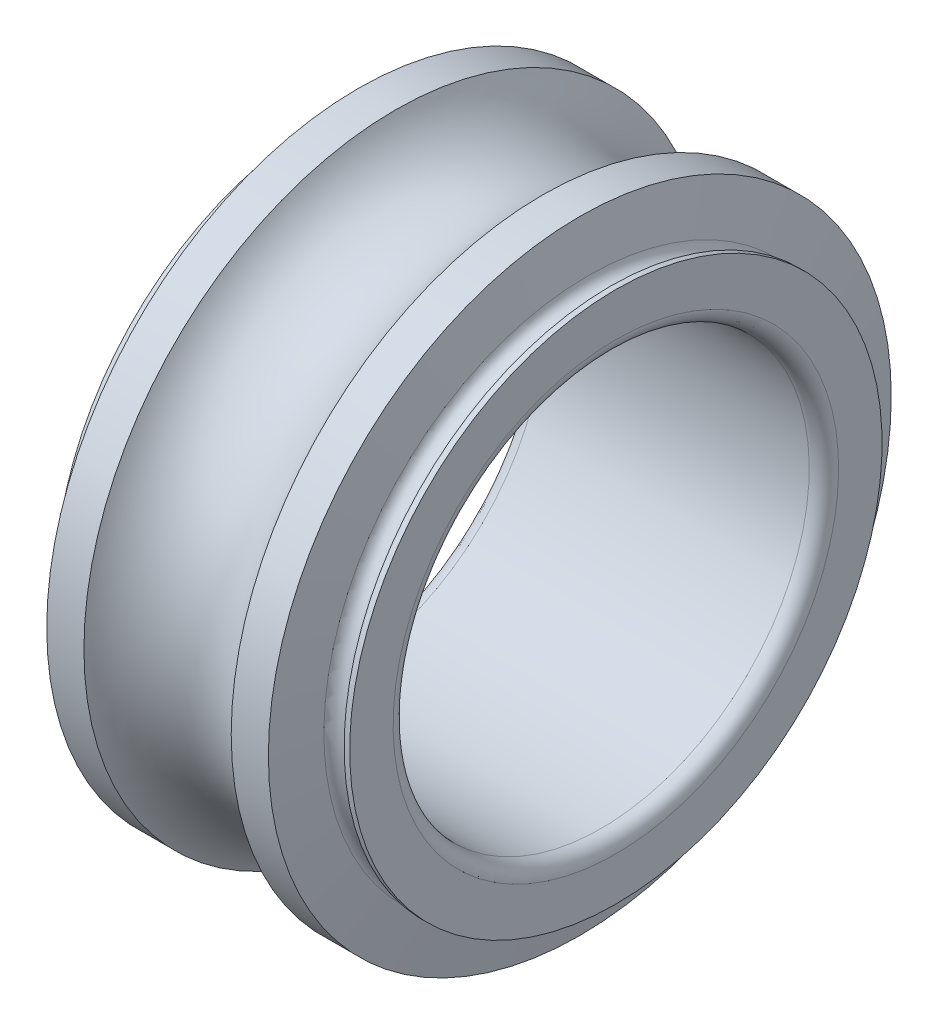
ISO-10303-21;
HEADER;
FILE_DESCRIPTION(('STEP AP214'),'2;1');
FILE_NAME('part.step','',(''),(''),'','','');
FILE_SCHEMA(('AUTOMOTIVE_DESIGN { 1 0 10303 214 1 1 1 1 }'));
ENDSEC;
DATA;
#1=APPLICATION_CONTEXT('core data for automotive mechanical design processes');
#2=APPLICATION_PROTOCOL_DEFINITION('international standard','automotive_design',2000,#1);
#3=PRODUCT_CONTEXT('',#1,'mechanical');
#4=PRODUCT('Part','Part','',(#3));
#5=PRODUCT_RELATED_PRODUCT_CATEGORY('part','',(#4));
#6=PRODUCT_DEFINITION_FORMATION('','',#4);
#7=PRODUCT_DEFINITION_CONTEXT('part definition',#1,'design');
#8=PRODUCT_DEFINITION('design','',#6,#7);
#9=PRODUCT_DEFINITION_SHAPE('','',#8);
#10=(LENGTH_UNIT() NAMED_UNIT(*) SI_UNIT(.MILLI.,.METRE.));
#11=(NAMED_UNIT(*) PLANE_ANGLE_UNIT() SI_UNIT($,.RADIAN.));
#12=(NAMED_UNIT(*) SI_UNIT($,.STERADIAN.) SOLID_ANGLE_UNIT());
#13=UNCERTAINTY_MEASURE_WITH_UNIT(LENGTH_MEASURE(1.E-05),#10,'distance_accuracy_value','');
#14=(GEOMETRIC_REPRESENTATION_CONTEXT(3) GLOBAL_UNCERTAINTY_ASSIGNED_CONTEXT((#13)) GLOBAL_UNIT_ASSIGNED_CONTEXT((#10,
#11,#12)) REPRESENTATION_CONTEXT('',''));
#15=CARTESIAN_POINT('',(0.,0.,0.));
#16=DIRECTION('',(0.,0.,1.));
#17=DIRECTION('',(1.,0.,0.));
#18=AXIS2_PLACEMENT_3D('',#15,#16,#17);
#19=CARTESIAN_POINT('',(9.76773972662286,0.,0.));
#20=DIRECTION('',(-1.,0.,0.));
#21=DIRECTION('',(0.,1.,0.));
#22=AXIS2_PLACEMENT_3D('',#19,#20,#21);
#23=CYLINDRICAL_SURFACE('',#22,12.72375);
#24=CARTESIAN_POINT('',(9.00849849385038,0.,0.));
#25=DIRECTION('',(1.,0.,0.));
#26=DIRECTION('',(0.,1.,0.));
#27=AXIS2_PLACEMENT_3D('',#24,#25,#26);
#28=CIRCLE('',#27,12.72375);
#29=CARTESIAN_POINT('',(9.00849849385038,12.72375,0.));
#30=VERTEX_POINT('',#29);
#31=EDGE_CURVE('E11',#30,#30,#28,.T.);
#32=ORIENTED_EDGE('',*,*,#31,.T.);
#33=EDGE_LOOP('',(#32));
#34=FACE_BOUND('',#33,.T.);
#35=CARTESIAN_POINT('',(10.5269809593953,0.,0.));
#36=DIRECTION('',(1.,0.,0.));
#37=DIRECTION('',(0.,1.,0.));
#38=AXIS2_PLACEMENT_3D('',#35,#36,#37);
#39=CIRCLE('',#38,12.72375);
#40=CARTESIAN_POINT('',(10.5269809593953,12.72375,0.));
#41=VERTEX_POINT('',#40);
#42=EDGE_CURVE('E103',#41,#41,#39,.T.);
#43=ORIENTED_EDGE('',*,*,#42,.F.);
#44=EDGE_LOOP('',(#43));
#45=FACE_BOUND('',#44,.T.);
#46=ADVANCED_FACE('F17',(#34,#45),#23,.T.);
#47=CARTESIAN_POINT('',(6.,0.,0.));
#48=DIRECTION('',(1.,0.,0.));
#49=DIRECTION('',(0.,0.,-1.));
#50=AXIS2_PLACEMENT_3D('',#47,#48,#49);
#51=TOROIDAL_SURFACE('',#50,14.25,3.3735);
#52=CARTESIAN_POINT('',(2.99150150614962,0.,0.));
#53=DIRECTION('',(1.,0.,0.));
#54=DIRECTION('',(0.,1.,0.));
#55=AXIS2_PLACEMENT_3D('',#52,#53,#54);
#56=CIRCLE('',#55,12.72375);
#57=CARTESIAN_POINT('',(2.99150150614962,12.72375,0.));
#58=VERTEX_POINT('',#57);
#59=EDGE_CURVE('E28',#58,#58,#56,.T.);
#60=ORIENTED_EDGE('',*,*,#59,.T.);
#61=EDGE_LOOP('',(#60));
#62=FACE_BOUND('',#61,.T.);
#63=ORIENTED_EDGE('',*,*,#31,.F.);
#64=EDGE_LOOP('',(#63));
#65=FACE_BOUND('',#64,.T.);
#66=ADVANCED_FACE('F138',(#62,#65),#51,.F.);
#67=CARTESIAN_POINT('',(2.23226027337715,0.,0.));
#68=DIRECTION('',(-1.,0.,0.));
#69=DIRECTION('',(0.,1.,0.));
#70=AXIS2_PLACEMENT_3D('',#67,#68,#69);
#71=CYLINDRICAL_SURFACE('',#70,12.72375);
#72=CARTESIAN_POINT('',(1.47301904060467,0.,0.));
#73=DIRECTION('',(1.,0.,0.));
#74=DIRECTION('',(0.,1.,0.));
#75=AXIS2_PLACEMENT_3D('',#72,#73,#74);
#76=CIRCLE('',#75,12.72375);
#77=CARTESIAN_POINT('',(1.47301904060467,12.72375,0.));
#78=VERTEX_POINT('',#77);
#79=EDGE_CURVE('E21',#78,#78,#76,.T.);
#80=ORIENTED_EDGE('',*,*,#79,.T.);
#81=EDGE_LOOP('',(#80));
#82=FACE_BOUND('',#81,.T.);
#83=ORIENTED_EDGE('',*,*,#59,.F.);
#84=EDGE_LOOP('',(#83));
#85=FACE_BOUND('',#84,.T.);
#86=ADVANCED_FACE('F19',(#82,#85),#71,.T.);
#87=CARTESIAN_POINT('',(1.30304568798912,0.,0.));
#88=DIRECTION('',(1.,0.,0.));
#89=DIRECTION('',(0.,1.,0.));
#90=AXIS2_PLACEMENT_3D('',#87,#88,#89);
#91=CONICAL_SURFACE('',#90,11.7597832154919,1.39626340159546);
#92=CARTESIAN_POINT('',(1.13307233537356,0.,0.));
#93=DIRECTION('',(1.,0.,0.));
#94=DIRECTION('',(0.,1.,0.));
#95=AXIS2_PLACEMENT_3D('',#92,#93,#94);
#96=CIRCLE('',#95,10.7958164309839);
#97=CARTESIAN_POINT('',(1.13307233537356,10.7958164309839,0.));
#98=VERTEX_POINT('',#97);
#99=EDGE_CURVE('E79',#98,#98,#96,.T.);
#100=ORIENTED_EDGE('',*,*,#99,.T.);
#101=EDGE_LOOP('',(#100));
#102=FACE_BOUND('',#101,.T.);
#103=ORIENTED_EDGE('',*,*,#79,.F.);
#104=EDGE_LOOP('',(#103));
#105=FACE_BOUND('',#104,.T.);
#106=ADVANCED_FACE('F158',(#102,#105),#91,.T.);
#107=CARTESIAN_POINT('',(0.684,0.,0.));
#108=DIRECTION('',(1.,0.,0.));
#109=DIRECTION('',(0.,0.,-1.));
#110=AXIS2_PLACEMENT_3D('',#107,#108,#109);
#111=TOROIDAL_SURFACE('',#110,10.875,0.456);
#112=CARTESIAN_POINT('',(0.228,0.,0.));
#113=DIRECTION('',(1.,0.,0.));
#114=DIRECTION('',(0.,1.,0.));
#115=AXIS2_PLACEMENT_3D('',#112,#113,#114);
#116=CIRCLE('',#115,10.875);
#117=CARTESIAN_POINT('',(0.228,10.875,0.));
#118=VERTEX_POINT('',#117);
#119=EDGE_CURVE('E74',#118,#118,#116,.T.);
#120=ORIENTED_EDGE('',*,*,#119,.T.);
#121=EDGE_LOOP('',(#120));
#122=FACE_BOUND('',#121,.T.);
#123=ORIENTED_EDGE('',*,*,#99,.F.);
#124=EDGE_LOOP('',(#123));
#125=FACE_BOUND('',#124,.T.);
#126=ADVANCED_FACE('F75',(#122,#125),#111,.F.);
#127=CARTESIAN_POINT('',(0.114,0.,0.));
#128=DIRECTION('',(-1.,0.,0.));
#129=DIRECTION('',(0.,1.,0.));
#130=AXIS2_PLACEMENT_3D('',#127,#128,#129);
#131=CYLINDRICAL_SURFACE('',#130,10.875);
#132=CARTESIAN_POINT('',(0.,0.,0.));
#133=DIRECTION('',(1.,0.,0.));
#134=DIRECTION('',(0.,1.,0.));
#135=AXIS2_PLACEMENT_3D('',#132,#133,#134);
#136=CIRCLE('',#135,10.875);
#137=CARTESIAN_POINT('',(0.,10.875,0.));
#138=VERTEX_POINT('',#137);
#139=EDGE_CURVE('E70',#138,#138,#136,.T.);
#140=ORIENTED_EDGE('',*,*,#139,.T.);
#141=EDGE_LOOP('',(#140));
#142=FACE_BOUND('',#141,.T.);
#143=ORIENTED_EDGE('',*,*,#119,.F.);
#144=EDGE_LOOP('',(#143));
#145=FACE_BOUND('',#144,.T.);
#146=ADVANCED_FACE('F149',(#142,#145),#131,.T.);
#147=CARTESIAN_POINT('',(0.,9.9875,0.));
#148=DIRECTION('',(-1.,0.,0.));
#149=DIRECTION('',(0.,-1.,0.));
#150=AXIS2_PLACEMENT_3D('',#147,#148,#149);
#151=PLANE('',#150);
#152=CARTESIAN_POINT('',(0.,0.,0.));
#153=DIRECTION('',(1.,0.,0.));
#154=DIRECTION('',(0.,1.,0.));
#155=AXIS2_PLACEMENT_3D('',#152,#153,#154);
#156=CIRCLE('',#155,9.1);
#157=CARTESIAN_POINT('',(0.,9.1,0.));
#158=VERTEX_POINT('',#157);
#159=EDGE_CURVE('E85',#158,#158,#156,.T.);
#160=ORIENTED_EDGE('',*,*,#159,.T.);
#161=EDGE_LOOP('',(#160));
#162=FACE_BOUND('',#161,.T.);
#163=ORIENTED_EDGE('',*,*,#139,.F.);
#164=EDGE_LOOP('',(#163));
#165=FACE_BOUND('',#164,.T.);
#166=ADVANCED_FACE('F134',(#162,#165),#151,.T.);
#167=CARTESIAN_POINT('',(0.6,0.,0.));
#168=DIRECTION('',(1.,0.,0.));
#169=DIRECTION('',(0.,0.,-1.));
#170=AXIS2_PLACEMENT_3D('',#167,#168,#169);
#171=TOROIDAL_SURFACE('',#170,9.1,0.6);
#172=CARTESIAN_POINT('',(0.6,0.,0.));
#173=DIRECTION('',(1.,0.,0.));
#174=DIRECTION('',(0.,1.,0.));
#175=AXIS2_PLACEMENT_3D('',#172,#173,#174);
#176=CIRCLE('',#175,8.5);
#177=CARTESIAN_POINT('',(0.6,8.5,0.));
#178=VERTEX_POINT('',#177);
#179=EDGE_CURVE('E93',#178,#178,#176,.T.);
#180=ORIENTED_EDGE('',*,*,#179,.T.);
#181=EDGE_LOOP('',(#180));
#182=FACE_BOUND('',#181,.T.);
#183=ORIENTED_EDGE('',*,*,#159,.F.);
#184=EDGE_LOOP('',(#183));
#185=FACE_BOUND('',#184,.T.);
#186=ADVANCED_FACE('F118',(#182,#185),#171,.T.);
#187=CARTESIAN_POINT('',(6.,0.,0.));
#188=DIRECTION('',(-1.,0.,0.));
#189=DIRECTION('',(0.,1.,0.));
#190=AXIS2_PLACEMENT_3D('',#187,#188,#189);
#191=CYLINDRICAL_SURFACE('',#190,8.5);
#192=CARTESIAN_POINT('',(11.4,0.,0.));
#193=DIRECTION('',(1.,0.,0.));
#194=DIRECTION('',(0.,1.,0.));
#195=AXIS2_PLACEMENT_3D('',#192,#193,#194);
#196=CIRCLE('',#195,8.5);
#197=CARTESIAN_POINT('',(11.4,8.5,0.));
#198=VERTEX_POINT('',#197);
#199=EDGE_CURVE('E90',#198,#198,#196,.T.);
#200=ORIENTED_EDGE('',*,*,#199,.T.);
#201=EDGE_LOOP('',(#200));
#202=FACE_BOUND('',#201,.T.);
#203=ORIENTED_EDGE('',*,*,#179,.F.);
#204=EDGE_LOOP('',(#203));
#205=FACE_BOUND('',#204,.T.);
#206=ADVANCED_FACE('F121',(#202,#205),#191,.F.);
#207=CARTESIAN_POINT('',(11.4,0.,0.));
#208=DIRECTION('',(1.,0.,0.));
#209=DIRECTION('',(0.,0.,-1.));
#210=AXIS2_PLACEMENT_3D('',#207,#208,#209);
#211=TOROIDAL_SURFACE('',#210,9.1,0.6);
#212=CARTESIAN_POINT('',(12.,0.,0.));
#213=DIRECTION('',(1.,0.,0.));
#214=DIRECTION('',(0.,1.,0.));
#215=AXIS2_PLACEMENT_3D('',#212,#213,#214);
#216=CIRCLE('',#215,9.1);
#217=CARTESIAN_POINT('',(12.,9.1,0.));
#218=VERTEX_POINT('',#217);
#219=EDGE_CURVE('E94',#218,#218,#216,.T.);
#220=ORIENTED_EDGE('',*,*,#219,.T.);
#221=EDGE_LOOP('',(#220));
#222=FACE_BOUND('',#221,.T.);
#223=ORIENTED_EDGE('',*,*,#199,.F.);
#224=EDGE_LOOP('',(#223));
#225=FACE_BOUND('',#224,.T.);
#226=ADVANCED_FACE('F123',(#222,#225),#211,.T.);
#227=CARTESIAN_POINT('',(12.,9.9875,0.));
#228=DIRECTION('',(1.,0.,0.));
#229=DIRECTION('',(0.,1.,0.));
#230=AXIS2_PLACEMENT_3D('',#227,#228,#229);
#231=PLANE('',#230);
#232=CARTESIAN_POINT('',(12.,0.,0.));
#233=DIRECTION('',(1.,0.,0.));
#234=DIRECTION('',(0.,1.,0.));
#235=AXIS2_PLACEMENT_3D('',#232,#233,#234);
#236=CIRCLE('',#235,10.875);
#237=CARTESIAN_POINT('',(12.,10.875,0.));
#238=VERTEX_POINT('',#237);
#239=EDGE_CURVE('E99',#238,#238,#236,.T.);
#240=ORIENTED_EDGE('',*,*,#239,.T.);
#241=EDGE_LOOP('',(#240));
#242=FACE_BOUND('',#241,.T.);
#243=ORIENTED_EDGE('',*,*,#219,.F.);
#244=EDGE_LOOP('',(#243));
#245=FACE_BOUND('',#244,.T.);
#246=ADVANCED_FACE('F131',(#242,#245),#231,.T.);
#247=CARTESIAN_POINT('',(11.886,0.,0.));
#248=DIRECTION('',(-1.,0.,0.));
#249=DIRECTION('',(0.,1.,0.));
#250=AXIS2_PLACEMENT_3D('',#247,#248,#249);
#251=CYLINDRICAL_SURFACE('',#250,10.875);
#252=CARTESIAN_POINT('',(11.772,0.,0.));
#253=DIRECTION('',(1.,0.,0.));
#254=DIRECTION('',(0.,1.,0.));
#255=AXIS2_PLACEMENT_3D('',#252,#253,#254);
#256=CIRCLE('',#255,10.875);
#257=CARTESIAN_POINT('',(11.772,10.875,0.));
#258=VERTEX_POINT('',#257);
#259=EDGE_CURVE('E87',#258,#258,#256,.T.);
#260=ORIENTED_EDGE('',*,*,#259,.T.);
#261=EDGE_LOOP('',(#260));
#262=FACE_BOUND('',#261,.T.);
#263=ORIENTED_EDGE('',*,*,#239,.F.);
#264=EDGE_LOOP('',(#263));
#265=FACE_BOUND('',#264,.T.);
#266=ADVANCED_FACE('F160',(#262,#265),#251,.T.);
#267=CARTESIAN_POINT('',(11.316,0.,0.));
#268=DIRECTION('',(1.,0.,0.));
#269=DIRECTION('',(0.,0.,-1.));
#270=AXIS2_PLACEMENT_3D('',#267,#268,#269);
#271=TOROIDAL_SURFACE('',#270,10.875,0.456);
#272=CARTESIAN_POINT('',(10.8669276646264,0.,0.));
#273=DIRECTION('',(1.,0.,0.));
#274=DIRECTION('',(0.,1.,0.));
#275=AXIS2_PLACEMENT_3D('',#272,#273,#274);
#276=CIRCLE('',#275,10.7958164309839);
#277=CARTESIAN_POINT('',(10.8669276646264,10.7958164309839,0.));
#278=VERTEX_POINT('',#277);
#279=EDGE_CURVE('E100',#278,#278,#276,.T.);
#280=ORIENTED_EDGE('',*,*,#279,.T.);
#281=EDGE_LOOP('',(#280));
#282=FACE_BOUND('',#281,.T.);
#283=ORIENTED_EDGE('',*,*,#259,.F.);
#284=EDGE_LOOP('',(#283));
#285=FACE_BOUND('',#284,.T.);
#286=ADVANCED_FACE('F155',(#282,#285),#271,.F.);
#287=CARTESIAN_POINT('',(10.6969543120109,0.,0.));
#288=DIRECTION('',(-1.,0.,0.));
#289=DIRECTION('',(0.,1.,0.));
#290=AXIS2_PLACEMENT_3D('',#287,#288,#289);
#291=CONICAL_SURFACE('',#290,11.7597832154919,1.39626340159546);
#292=ORIENTED_EDGE('',*,*,#42,.T.);
#293=EDGE_LOOP('',(#292));
#294=FACE_BOUND('',#293,.T.);
#295=ORIENTED_EDGE('',*,*,#279,.F.);
#296=EDGE_LOOP('',(#295));
#297=FACE_BOUND('',#296,.T.);
#298=ADVANCED_FACE('F152',(#294,#297),#291,.T.);
#299=CLOSED_SHELL('',(#46,#66,#86,#106,#126,#146,#166,#186,#206,#226,#246,#266,#286,#298));
#300=MANIFOLD_SOLID_BREP('B1',#299);
#301=ADVANCED_BREP_SHAPE_REPRESENTATION('',(#18,#300),#14);
#302=SHAPE_DEFINITION_REPRESENTATION(#9,#301);
ENDSEC;
END-ISO-10303-21;
